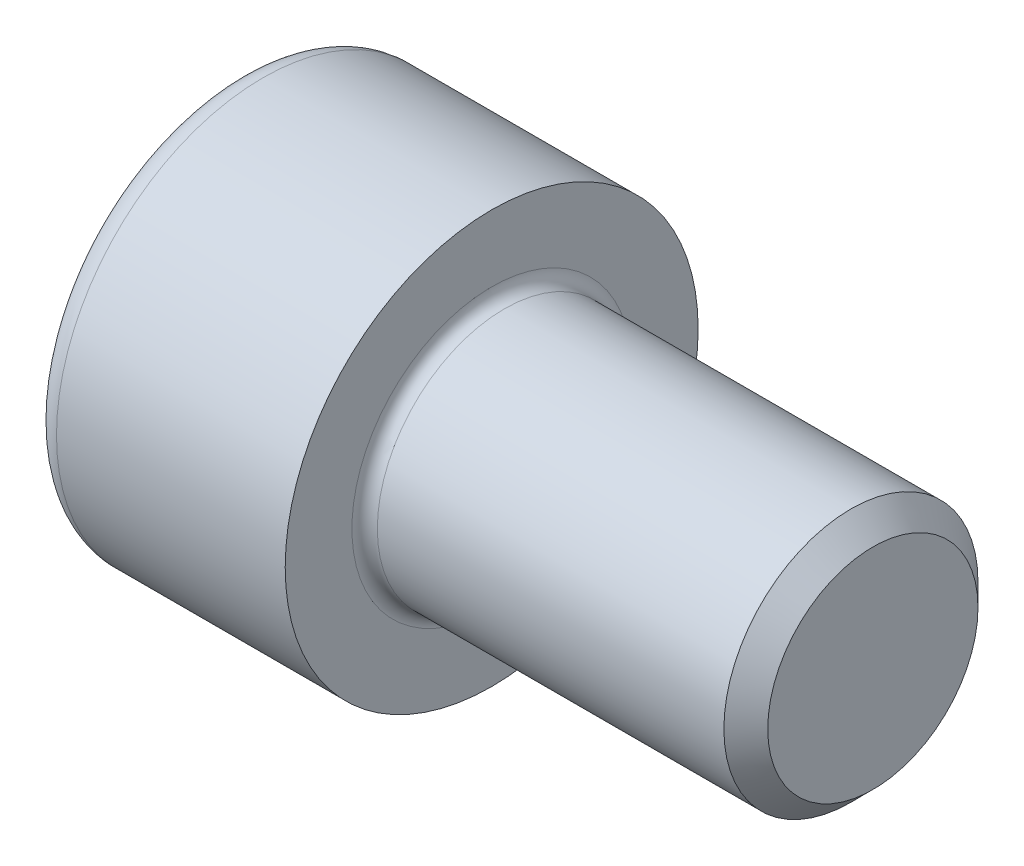
ISO-10303-21;
HEADER;
FILE_DESCRIPTION(('STEP AP214'),'2;1');
FILE_NAME('part.step','',(''),(''),'','','');
FILE_SCHEMA(('AUTOMOTIVE_DESIGN { 1 0 10303 214 1 1 1 1 }'));
ENDSEC;
DATA;
#1=APPLICATION_CONTEXT('core data for automotive mechanical design processes');
#2=APPLICATION_PROTOCOL_DEFINITION('international standard','automotive_design',2000,#1);
#3=PRODUCT_CONTEXT('',#1,'mechanical');
#4=PRODUCT('Part','Part','',(#3));
#5=PRODUCT_RELATED_PRODUCT_CATEGORY('part','',(#4));
#6=PRODUCT_DEFINITION_FORMATION('','',#4);
#7=PRODUCT_DEFINITION_CONTEXT('part definition',#1,'design');
#8=PRODUCT_DEFINITION('design','',#6,#7);
#9=PRODUCT_DEFINITION_SHAPE('','',#8);
#10=(LENGTH_UNIT() NAMED_UNIT(*) SI_UNIT(.MILLI.,.METRE.));
#11=(NAMED_UNIT(*) PLANE_ANGLE_UNIT() SI_UNIT($,.RADIAN.));
#12=(NAMED_UNIT(*) SI_UNIT($,.STERADIAN.) SOLID_ANGLE_UNIT());
#13=UNCERTAINTY_MEASURE_WITH_UNIT(LENGTH_MEASURE(1.E-05),#10,'distance_accuracy_value','');
#14=(GEOMETRIC_REPRESENTATION_CONTEXT(3) GLOBAL_UNCERTAINTY_ASSIGNED_CONTEXT((#13)) GLOBAL_UNIT_ASSIGNED_CONTEXT((#10,
#11,#12)) REPRESENTATION_CONTEXT('',''));
#15=CARTESIAN_POINT('',(0.,0.,0.));
#16=DIRECTION('',(0.,0.,1.));
#17=DIRECTION('',(1.,0.,0.));
#18=AXIS2_PLACEMENT_3D('',#15,#16,#17);
#19=CARTESIAN_POINT('',(0.,0.,0.));
#20=DIRECTION('',(-1.,0.,0.));
#21=DIRECTION('',(0.,0.,1.));
#22=AXIS2_PLACEMENT_3D('',#19,#20,#21);
#23=PLANE('',#22);
#24=DIRECTION('',(0.,-0.5,0.866025403784439));
#25=VECTOR('',#24,1.);
#26=CARTESIAN_POINT('',(0.,3.47564862052155,0.));
#27=LINE('',#26,#25);
#28=CARTESIAN_POINT('',(0.,3.47564862052155,0.));
#29=VERTEX_POINT('',#28);
#30=CARTESIAN_POINT('',(0.,1.73782431026077,3.01));
#31=VERTEX_POINT('',#30);
#32=EDGE_CURVE('E265',#29,#31,#27,.T.);
#33=ORIENTED_EDGE('',*,*,#32,.T.);
#34=DIRECTION('',(0.,1.,0.));
#35=VECTOR('',#34,1.);
#36=CARTESIAN_POINT('',(0.,-1.73782431026077,3.01));
#37=LINE('',#36,#35);
#38=CARTESIAN_POINT('',(0.,-1.73782431026077,3.01));
#39=VERTEX_POINT('',#38);
#40=EDGE_CURVE('E137',#39,#31,#37,.T.);
#41=ORIENTED_EDGE('',*,*,#40,.F.);
#42=DIRECTION('',(0.,-0.500000000000001,-0.866025403784438));
#43=VECTOR('',#42,1.);
#44=CARTESIAN_POINT('',(0.,-1.73782431026077,3.01));
#45=LINE('',#44,#43);
#46=CARTESIAN_POINT('',(0.,-3.47564862052155,0.));
#47=VERTEX_POINT('',#46);
#48=EDGE_CURVE('E268',#39,#47,#45,.T.);
#49=ORIENTED_EDGE('',*,*,#48,.T.);
#50=DIRECTION('',(0.,0.499999999999999,-0.866025403784439));
#51=VECTOR('',#50,1.);
#52=CARTESIAN_POINT('',(0.,-3.47564862052155,0.));
#53=LINE('',#52,#51);
#54=CARTESIAN_POINT('',(0.,-1.73782431026078,-3.01));
#55=VERTEX_POINT('',#54);
#56=EDGE_CURVE('E271',#47,#55,#53,.T.);
#57=ORIENTED_EDGE('',*,*,#56,.T.);
#58=DIRECTION('',(0.,-1.,0.));
#59=VECTOR('',#58,1.);
#60=CARTESIAN_POINT('',(0.,1.73782431026077,-3.01));
#61=LINE('',#60,#59);
#62=CARTESIAN_POINT('',(0.,1.73782431026077,-3.01));
#63=VERTEX_POINT('',#62);
#64=EDGE_CURVE('E274',#63,#55,#61,.T.);
#65=ORIENTED_EDGE('',*,*,#64,.F.);
#66=DIRECTION('',(0.,-0.500000000000001,-0.866025403784438));
#67=VECTOR('',#66,1.);
#68=CARTESIAN_POINT('',(0.,3.47564862052155,0.));
#69=LINE('',#68,#67);
#70=EDGE_CURVE('E132',#29,#63,#69,.T.);
#71=ORIENTED_EDGE('',*,*,#70,.F.);
#72=EDGE_LOOP('',(#33,#41,#49,#57,#65,#71));
#73=FACE_BOUND('',#72,.T.);
#74=CARTESIAN_POINT('',(0.,0.,0.));
#75=DIRECTION('',(-1.,0.,0.));
#76=DIRECTION('',(0.,0.,1.));
#77=AXIS2_PLACEMENT_3D('',#74,#75,#76);
#78=CIRCLE('',#77,5.7);
#79=CARTESIAN_POINT('',(0.,0.,5.7));
#80=VERTEX_POINT('',#79);
#81=EDGE_CURVE('E49',#80,#80,#78,.T.);
#82=ORIENTED_EDGE('',*,*,#81,.T.);
#83=EDGE_LOOP('',(#82));
#84=FACE_BOUND('',#83,.T.);
#85=ADVANCED_FACE('F41',(#73,#84),#23,.T.);
#86=CARTESIAN_POINT('',(-31.75,0.,0.));
#87=DIRECTION('',(-1.,0.,0.));
#88=DIRECTION('',(0.,0.,1.));
#89=AXIS2_PLACEMENT_3D('',#86,#87,#88);
#90=CYLINDRICAL_SURFACE('',#89,6.5);
#91=CARTESIAN_POINT('',(0.800000000000002,0.,0.));
#92=DIRECTION('',(-1.,0.,0.));
#93=DIRECTION('',(0.,0.,1.));
#94=AXIS2_PLACEMENT_3D('',#91,#92,#93);
#95=CIRCLE('',#94,6.5);
#96=CARTESIAN_POINT('',(0.800000000000002,0.,6.5));
#97=VERTEX_POINT('',#96);
#98=EDGE_CURVE('E11',#97,#97,#95,.F.);
#99=ORIENTED_EDGE('',*,*,#98,.T.);
#100=EDGE_LOOP('',(#99));
#101=FACE_BOUND('',#100,.T.);
#102=CARTESIAN_POINT('',(8.,0.,0.));
#103=DIRECTION('',(-1.,0.,0.));
#104=DIRECTION('',(0.,0.,1.));
#105=AXIS2_PLACEMENT_3D('',#102,#103,#104);
#106=CIRCLE('',#105,6.5);
#107=CARTESIAN_POINT('',(8.,0.,6.5));
#108=VERTEX_POINT('',#107);
#109=EDGE_CURVE('E155',#108,#108,#106,.T.);
#110=ORIENTED_EDGE('',*,*,#109,.T.);
#111=EDGE_LOOP('',(#110));
#112=FACE_BOUND('',#111,.T.);
#113=ADVANCED_FACE('F180',(#101,#112),#90,.T.);
#114=CARTESIAN_POINT('',(8.,6.5,0.));
#115=DIRECTION('',(1.,0.,0.));
#116=DIRECTION('',(0.,0.,-1.));
#117=AXIS2_PLACEMENT_3D('',#114,#115,#116);
#118=PLANE('',#117);
#119=CARTESIAN_POINT('',(8.,0.,0.));
#120=DIRECTION('',(1.,0.,0.));
#121=DIRECTION('',(0.,0.,-1.));
#122=AXIS2_PLACEMENT_3D('',#119,#120,#121);
#123=CIRCLE('',#122,4.4);
#124=CARTESIAN_POINT('',(8.,0.,-4.4));
#125=VERTEX_POINT('',#124);
#126=EDGE_CURVE('E158',#125,#125,#123,.F.);
#127=ORIENTED_EDGE('',*,*,#126,.T.);
#128=EDGE_LOOP('',(#127));
#129=FACE_BOUND('',#128,.T.);
#130=ORIENTED_EDGE('',*,*,#109,.F.);
#131=EDGE_LOOP('',(#130));
#132=FACE_BOUND('',#131,.T.);
#133=ADVANCED_FACE('F185',(#129,#132),#118,.T.);
#134=CARTESIAN_POINT('',(-31.75,0.,0.));
#135=DIRECTION('',(-1.,0.,0.));
#136=DIRECTION('',(0.,0.,1.));
#137=AXIS2_PLACEMENT_3D('',#134,#135,#136);
#138=CYLINDRICAL_SURFACE('',#137,4.);
#139=CARTESIAN_POINT('',(8.4,0.,0.));
#140=DIRECTION('',(1.,0.,0.));
#141=DIRECTION('',(0.,0.,-1.));
#142=AXIS2_PLACEMENT_3D('',#139,#140,#141);
#143=CIRCLE('',#142,4.);
#144=CARTESIAN_POINT('',(8.4,0.,-4.));
#145=VERTEX_POINT('',#144);
#146=EDGE_CURVE('E161',#145,#145,#143,.T.);
#147=ORIENTED_EDGE('',*,*,#146,.T.);
#148=EDGE_LOOP('',(#147));
#149=FACE_BOUND('',#148,.T.);
#150=CARTESIAN_POINT('',(19.3095,0.,0.));
#151=DIRECTION('',(-1.,0.,0.));
#152=DIRECTION('',(0.,0.,1.));
#153=AXIS2_PLACEMENT_3D('',#150,#151,#152);
#154=CIRCLE('',#153,4.);
#155=CARTESIAN_POINT('',(19.3095,0.,4.));
#156=VERTEX_POINT('',#155);
#157=EDGE_CURVE('E152',#156,#156,#154,.T.);
#158=ORIENTED_EDGE('',*,*,#157,.T.);
#159=EDGE_LOOP('',(#158));
#160=FACE_BOUND('',#159,.T.);
#161=ADVANCED_FACE('F191',(#149,#160),#138,.T.);
#162=CARTESIAN_POINT('',(20.,0.,0.));
#163=DIRECTION('',(-1.,0.,0.));
#164=DIRECTION('',(0.,0.,1.));
#165=AXIS2_PLACEMENT_3D('',#162,#163,#164);
#166=CONICAL_SURFACE('',#165,3.3095,0.78539816339745);
#167=ORIENTED_EDGE('',*,*,#157,.F.);
#168=EDGE_LOOP('',(#167));
#169=FACE_BOUND('',#168,.T.);
#170=CARTESIAN_POINT('',(20.,0.,0.));
#171=DIRECTION('',(-1.,0.,0.));
#172=DIRECTION('',(0.,0.,1.));
#173=AXIS2_PLACEMENT_3D('',#170,#171,#172);
#174=CIRCLE('',#173,3.3095);
#175=CARTESIAN_POINT('',(20.,0.,3.3095));
#176=VERTEX_POINT('',#175);
#177=EDGE_CURVE('E148',#176,#176,#174,.T.);
#178=ORIENTED_EDGE('',*,*,#177,.T.);
#179=EDGE_LOOP('',(#178));
#180=FACE_BOUND('',#179,.T.);
#181=ADVANCED_FACE('F195',(#169,#180),#166,.T.);
#182=CARTESIAN_POINT('',(20.,3.3095,0.));
#183=DIRECTION('',(1.,0.,0.));
#184=DIRECTION('',(0.,0.,-1.));
#185=AXIS2_PLACEMENT_3D('',#182,#183,#184);
#186=PLANE('',#185);
#187=ORIENTED_EDGE('',*,*,#177,.F.);
#188=EDGE_LOOP('',(#187));
#189=FACE_BOUND('',#188,.T.);
#190=ADVANCED_FACE('F177',(#189),#186,.T.);
#191=CARTESIAN_POINT('',(8.4,0.,0.));
#192=DIRECTION('',(1.,0.,0.));
#193=DIRECTION('',(0.,0.,-1.));
#194=AXIS2_PLACEMENT_3D('',#191,#192,#193);
#195=TOROIDAL_SURFACE('',#194,4.4,0.4);
#196=ORIENTED_EDGE('',*,*,#146,.F.);
#197=EDGE_LOOP('',(#196));
#198=FACE_BOUND('',#197,.T.);
#199=ORIENTED_EDGE('',*,*,#126,.F.);
#200=EDGE_LOOP('',(#199));
#201=FACE_BOUND('',#200,.T.);
#202=ADVANCED_FACE('F168',(#198,#201),#195,.F.);
#203=CARTESIAN_POINT('',(0.800000000000002,0.,0.));
#204=DIRECTION('',(-1.,0.,0.));
#205=DIRECTION('',(0.,0.,1.));
#206=AXIS2_PLACEMENT_3D('',#203,#204,#205);
#207=TOROIDAL_SURFACE('',#206,5.7,0.8);
#208=ORIENTED_EDGE('',*,*,#98,.F.);
#209=EDGE_LOOP('',(#208));
#210=FACE_BOUND('',#209,.T.);
#211=ORIENTED_EDGE('',*,*,#81,.F.);
#212=EDGE_LOOP('',(#211));
#213=FACE_BOUND('',#212,.T.);
#214=ADVANCED_FACE('F43',(#210,#213),#207,.T.);
#215=CARTESIAN_POINT('',(4.,3.47564862052155,0.));
#216=DIRECTION('',(0.,-0.866025403784439,-0.5));
#217=DIRECTION('',(0.,0.5,-0.866025403784439));
#218=AXIS2_PLACEMENT_3D('',#215,#216,#217);
#219=PLANE('',#218);
#220=ORIENTED_EDGE('',*,*,#32,.F.);
#221=DIRECTION('',(-1.,0.,0.));
#222=VECTOR('',#221,1.);
#223=CARTESIAN_POINT('',(4.,3.47564862052155,0.));
#224=LINE('',#223,#222);
#225=CARTESIAN_POINT('',(4.,3.47564862052155,0.));
#226=VERTEX_POINT('',#225);
#227=EDGE_CURVE('E255',#226,#29,#224,.T.);
#228=ORIENTED_EDGE('',*,*,#227,.F.);
#229=DIRECTION('',(0.,-0.5,0.866025403784439));
#230=VECTOR('',#229,1.);
#231=CARTESIAN_POINT('',(4.,3.47564862052155,0.));
#232=LINE('',#231,#230);
#233=CARTESIAN_POINT('',(4.,2.60673646539116,1.505));
#234=VERTEX_POINT('',#233);
#235=EDGE_CURVE('E124',#226,#234,#232,.T.);
#236=ORIENTED_EDGE('',*,*,#235,.T.);
#237=CARTESIAN_POINT('',(4.,1.73782431026077,3.01));
#238=VERTEX_POINT('',#237);
#239=EDGE_CURVE('E115',#234,#238,#232,.T.);
#240=ORIENTED_EDGE('',*,*,#239,.T.);
#241=DIRECTION('',(-1.,0.,0.));
#242=VECTOR('',#241,1.);
#243=CARTESIAN_POINT('',(4.,1.73782431026077,3.01));
#244=LINE('',#243,#242);
#245=EDGE_CURVE('E129',#238,#31,#244,.T.);
#246=ORIENTED_EDGE('',*,*,#245,.T.);
#247=EDGE_LOOP('',(#220,#228,#236,#240,#246));
#248=FACE_BOUND('',#247,.T.);
#249=ADVANCED_FACE('F128',(#248),#219,.T.);
#250=CARTESIAN_POINT('',(4.,-1.73782431026077,3.01));
#251=DIRECTION('',(0.,0.,1.));
#252=DIRECTION('',(0.,-1.,0.));
#253=AXIS2_PLACEMENT_3D('',#250,#251,#252);
#254=PLANE('',#253);
#255=ORIENTED_EDGE('',*,*,#40,.T.);
#256=ORIENTED_EDGE('',*,*,#245,.F.);
#257=DIRECTION('',(0.,1.,0.));
#258=VECTOR('',#257,1.);
#259=CARTESIAN_POINT('',(4.,-1.73782431026077,3.01));
#260=LINE('',#259,#258);
#261=CARTESIAN_POINT('',(4.,0.,3.01));
#262=VERTEX_POINT('',#261);
#263=EDGE_CURVE('E112',#262,#238,#260,.T.);
#264=ORIENTED_EDGE('',*,*,#263,.F.);
#265=CARTESIAN_POINT('',(4.,-1.73782431026077,3.01));
#266=VERTEX_POINT('',#265);
#267=EDGE_CURVE('E123',#266,#262,#260,.T.);
#268=ORIENTED_EDGE('',*,*,#267,.F.);
#269=DIRECTION('',(-1.,0.,0.));
#270=VECTOR('',#269,1.);
#271=CARTESIAN_POINT('',(4.,-1.73782431026077,3.01));
#272=LINE('',#271,#270);
#273=EDGE_CURVE('E139',#266,#39,#272,.T.);
#274=ORIENTED_EDGE('',*,*,#273,.T.);
#275=EDGE_LOOP('',(#255,#256,#264,#268,#274));
#276=FACE_BOUND('',#275,.T.);
#277=ADVANCED_FACE('F134',(#276),#254,.F.);
#278=CARTESIAN_POINT('',(4.,-1.73782431026077,3.01));
#279=DIRECTION('',(0.,0.866025403784438,-0.500000000000001));
#280=DIRECTION('',(0.,0.500000000000001,0.866025403784438));
#281=AXIS2_PLACEMENT_3D('',#278,#279,#280);
#282=PLANE('',#281);
#283=ORIENTED_EDGE('',*,*,#48,.F.);
#284=ORIENTED_EDGE('',*,*,#273,.F.);
#285=DIRECTION('',(0.,-0.500000000000001,-0.866025403784438));
#286=VECTOR('',#285,1.);
#287=CARTESIAN_POINT('',(4.,-1.73782431026077,3.01));
#288=LINE('',#287,#286);
#289=CARTESIAN_POINT('',(4.,-2.60673646539116,1.505));
#290=VERTEX_POINT('',#289);
#291=EDGE_CURVE('E294',#266,#290,#288,.T.);
#292=ORIENTED_EDGE('',*,*,#291,.T.);
#293=CARTESIAN_POINT('',(4.,-3.47564862052155,0.));
#294=VERTEX_POINT('',#293);
#295=EDGE_CURVE('E283',#290,#294,#288,.T.);
#296=ORIENTED_EDGE('',*,*,#295,.T.);
#297=DIRECTION('',(-1.,0.,0.));
#298=VECTOR('',#297,1.);
#299=CARTESIAN_POINT('',(4.,-3.47564862052155,0.));
#300=LINE('',#299,#298);
#301=EDGE_CURVE('E144',#294,#47,#300,.T.);
#302=ORIENTED_EDGE('',*,*,#301,.T.);
#303=EDGE_LOOP('',(#283,#284,#292,#296,#302));
#304=FACE_BOUND('',#303,.T.);
#305=ADVANCED_FACE('F209',(#304),#282,.T.);
#306=CARTESIAN_POINT('',(4.,-3.47564862052155,0.));
#307=DIRECTION('',(0.,0.866025403784439,0.5));
#308=DIRECTION('',(0.,-0.499999999999999,0.866025403784439));
#309=AXIS2_PLACEMENT_3D('',#306,#307,#308);
#310=PLANE('',#309);
#311=ORIENTED_EDGE('',*,*,#56,.F.);
#312=ORIENTED_EDGE('',*,*,#301,.F.);
#313=DIRECTION('',(0.,0.499999999999999,-0.866025403784439));
#314=VECTOR('',#313,1.);
#315=CARTESIAN_POINT('',(4.,-3.47564862052155,0.));
#316=LINE('',#315,#314);
#317=CARTESIAN_POINT('',(4.,-2.60673646539116,-1.505));
#318=VERTEX_POINT('',#317);
#319=EDGE_CURVE('E261',#294,#318,#316,.T.);
#320=ORIENTED_EDGE('',*,*,#319,.T.);
#321=CARTESIAN_POINT('',(4.,-1.73782431026078,-3.01));
#322=VERTEX_POINT('',#321);
#323=EDGE_CURVE('E293',#318,#322,#316,.T.);
#324=ORIENTED_EDGE('',*,*,#323,.T.);
#325=DIRECTION('',(-1.,0.,0.));
#326=VECTOR('',#325,1.);
#327=CARTESIAN_POINT('',(4.,-1.73782431026078,-3.01));
#328=LINE('',#327,#326);
#329=EDGE_CURVE('E254',#322,#55,#328,.T.);
#330=ORIENTED_EDGE('',*,*,#329,.T.);
#331=EDGE_LOOP('',(#311,#312,#320,#324,#330));
#332=FACE_BOUND('',#331,.T.);
#333=ADVANCED_FACE('F212',(#332),#310,.T.);
#334=CARTESIAN_POINT('',(4.,1.73782431026077,-3.01));
#335=DIRECTION('',(0.,0.,-1.));
#336=DIRECTION('',(0.,1.,0.));
#337=AXIS2_PLACEMENT_3D('',#334,#335,#336);
#338=PLANE('',#337);
#339=ORIENTED_EDGE('',*,*,#64,.T.);
#340=ORIENTED_EDGE('',*,*,#329,.F.);
#341=DIRECTION('',(0.,-1.,0.));
#342=VECTOR('',#341,1.);
#343=CARTESIAN_POINT('',(4.,1.73782431026077,-3.01));
#344=LINE('',#343,#342);
#345=CARTESIAN_POINT('',(4.,0.,-3.01));
#346=VERTEX_POINT('',#345);
#347=EDGE_CURVE('E258',#346,#322,#344,.T.);
#348=ORIENTED_EDGE('',*,*,#347,.F.);
#349=CARTESIAN_POINT('',(4.,1.73782431026077,-3.01));
#350=VERTEX_POINT('',#349);
#351=EDGE_CURVE('E56',#350,#346,#344,.T.);
#352=ORIENTED_EDGE('',*,*,#351,.F.);
#353=DIRECTION('',(-1.,0.,0.));
#354=VECTOR('',#353,1.);
#355=CARTESIAN_POINT('',(4.,1.73782431026077,-3.01));
#356=LINE('',#355,#354);
#357=EDGE_CURVE('E251',#350,#63,#356,.T.);
#358=ORIENTED_EDGE('',*,*,#357,.T.);
#359=EDGE_LOOP('',(#339,#340,#348,#352,#358));
#360=FACE_BOUND('',#359,.T.);
#361=ADVANCED_FACE('F216',(#360),#338,.F.);
#362=CARTESIAN_POINT('',(4.,3.47564862052155,0.));
#363=DIRECTION('',(0.,0.866025403784438,-0.500000000000001));
#364=DIRECTION('',(0.,0.500000000000001,0.866025403784438));
#365=AXIS2_PLACEMENT_3D('',#362,#363,#364);
#366=PLANE('',#365);
#367=ORIENTED_EDGE('',*,*,#70,.T.);
#368=ORIENTED_EDGE('',*,*,#357,.F.);
#369=DIRECTION('',(0.,-0.500000000000001,-0.866025403784438));
#370=VECTOR('',#369,1.);
#371=CARTESIAN_POINT('',(4.,3.47564862052155,0.));
#372=LINE('',#371,#370);
#373=CARTESIAN_POINT('',(4.,2.60673646539116,-1.505));
#374=VERTEX_POINT('',#373);
#375=EDGE_CURVE('E241',#374,#350,#372,.T.);
#376=ORIENTED_EDGE('',*,*,#375,.F.);
#377=EDGE_CURVE('E247',#226,#374,#372,.T.);
#378=ORIENTED_EDGE('',*,*,#377,.F.);
#379=ORIENTED_EDGE('',*,*,#227,.T.);
#380=EDGE_LOOP('',(#367,#368,#376,#378,#379));
#381=FACE_BOUND('',#380,.T.);
#382=ADVANCED_FACE('F220',(#381),#366,.F.);
#383=CARTESIAN_POINT('',(4.,3.47564862052155,0.));
#384=DIRECTION('',(1.,0.,0.));
#385=DIRECTION('',(0.,0.,-1.));
#386=AXIS2_PLACEMENT_3D('',#383,#384,#385);
#387=PLANE('',#386);
#388=ORIENTED_EDGE('',*,*,#347,.T.);
#389=ORIENTED_EDGE('',*,*,#323,.F.);
#390=CARTESIAN_POINT('',(4.,0.,0.));
#391=DIRECTION('',(-1.,0.,0.));
#392=DIRECTION('',(0.,0.,1.));
#393=AXIS2_PLACEMENT_3D('',#390,#391,#392);
#394=CIRCLE('',#393,3.01);
#395=EDGE_CURVE('E289',#346,#318,#394,.T.);
#396=ORIENTED_EDGE('',*,*,#395,.F.);
#397=EDGE_LOOP('',(#388,#389,#396));
#398=FACE_BOUND('',#397,.T.);
#399=ADVANCED_FACE('F224',(#398),#387,.F.);
#400=ORIENTED_EDGE('',*,*,#319,.F.);
#401=ORIENTED_EDGE('',*,*,#295,.F.);
#402=EDGE_CURVE('E142',#318,#290,#394,.T.);
#403=ORIENTED_EDGE('',*,*,#402,.F.);
#404=EDGE_LOOP('',(#400,#401,#403));
#405=FACE_BOUND('',#404,.T.);
#406=ADVANCED_FACE('F227',(#405),#387,.F.);
#407=ORIENTED_EDGE('',*,*,#291,.F.);
#408=ORIENTED_EDGE('',*,*,#267,.T.);
#409=EDGE_CURVE('E138',#290,#262,#394,.T.);
#410=ORIENTED_EDGE('',*,*,#409,.F.);
#411=EDGE_LOOP('',(#407,#408,#410));
#412=FACE_BOUND('',#411,.T.);
#413=ADVANCED_FACE('F232',(#412),#387,.F.);
#414=ORIENTED_EDGE('',*,*,#263,.T.);
#415=ORIENTED_EDGE('',*,*,#239,.F.);
#416=EDGE_CURVE('E118',#262,#234,#394,.T.);
#417=ORIENTED_EDGE('',*,*,#416,.F.);
#418=EDGE_LOOP('',(#414,#415,#417));
#419=FACE_BOUND('',#418,.T.);
#420=ADVANCED_FACE('F114',(#419),#387,.F.);
#421=ORIENTED_EDGE('',*,*,#235,.F.);
#422=ORIENTED_EDGE('',*,*,#377,.T.);
#423=EDGE_CURVE('E149',#234,#374,#394,.T.);
#424=ORIENTED_EDGE('',*,*,#423,.F.);
#425=EDGE_LOOP('',(#421,#422,#424));
#426=FACE_BOUND('',#425,.T.);
#427=ADVANCED_FACE('F235',(#426),#387,.F.);
#428=ORIENTED_EDGE('',*,*,#375,.T.);
#429=ORIENTED_EDGE('',*,*,#351,.T.);
#430=EDGE_CURVE('E244',#374,#346,#394,.T.);
#431=ORIENTED_EDGE('',*,*,#430,.F.);
#432=EDGE_LOOP('',(#428,#429,#431));
#433=FACE_BOUND('',#432,.T.);
#434=ADVANCED_FACE('F205',(#433),#387,.F.);
#435=CARTESIAN_POINT('',(4.,0.,0.));
#436=DIRECTION('',(-1.,0.,0.));
#437=DIRECTION('',(0.,0.,1.));
#438=AXIS2_PLACEMENT_3D('',#435,#436,#437);
#439=CONICAL_SURFACE('',#438,3.01,1.04719755119659);
#440=CARTESIAN_POINT('',(5.73782431026079,0.,0.));
#441=VERTEX_POINT('',#440);
#442=VERTEX_LOOP('',#441);
#443=FACE_BOUND('',#442,.T.);
#444=ORIENTED_EDGE('',*,*,#416,.T.);
#445=ORIENTED_EDGE('',*,*,#423,.T.);
#446=ORIENTED_EDGE('',*,*,#430,.T.);
#447=ORIENTED_EDGE('',*,*,#395,.T.);
#448=ORIENTED_EDGE('',*,*,#402,.T.);
#449=ORIENTED_EDGE('',*,*,#409,.T.);
#450=EDGE_LOOP('',(#444,#445,#446,#447,#448,#449));
#451=FACE_BOUND('',#450,.T.);
#452=ADVANCED_FACE('F203',(#443,#451),#439,.F.);
#453=CLOSED_SHELL('',(#85,#113,#133,#161,#181,#190,#202,#214,#249,#277,#305,#333,#361,#382,#399,
#406,#413,#420,#427,#434,#452));
#454=MANIFOLD_SOLID_BREP('B2',#453);
#455=ADVANCED_BREP_SHAPE_REPRESENTATION('',(#18,#454),#14);
#456=SHAPE_DEFINITION_REPRESENTATION(#9,#455);
ENDSEC;
END-ISO-10303-21;
